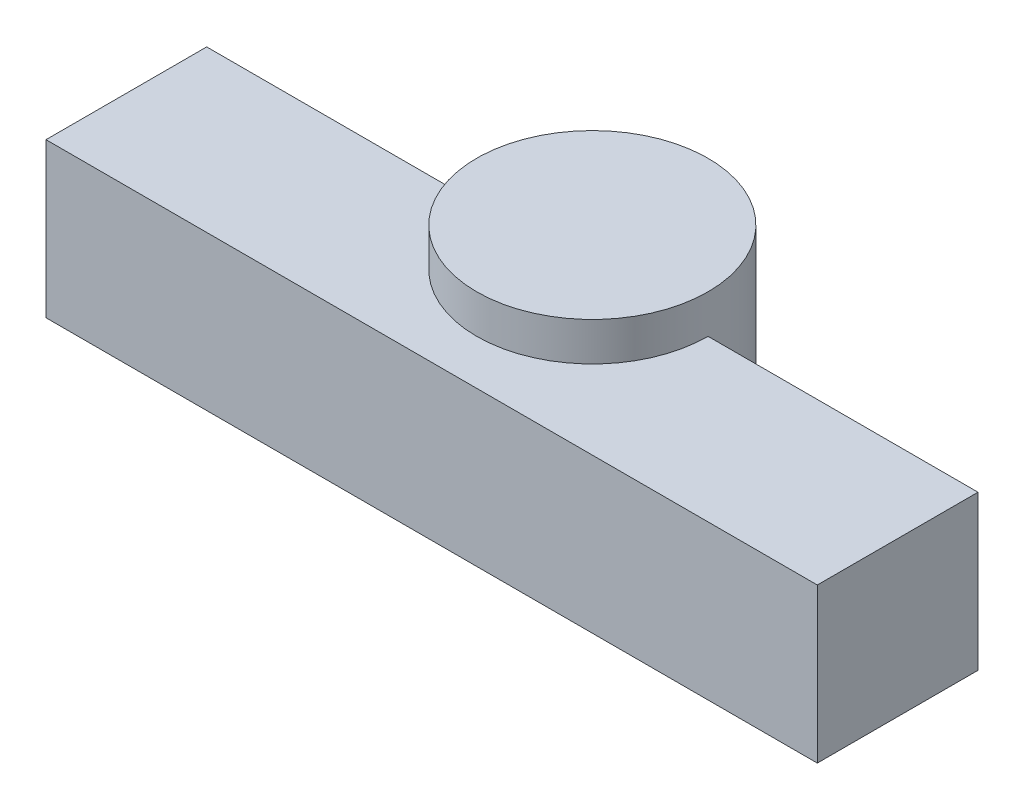
ISO-10303-21;
HEADER;
FILE_DESCRIPTION(('STEP AP214'),'2;1');
FILE_NAME('part.step','',(''),(''),'','','');
FILE_SCHEMA(('AUTOMOTIVE_DESIGN { 1 0 10303 214 1 1 1 1 }'));
ENDSEC;
DATA;
#1=APPLICATION_CONTEXT('core data for automotive mechanical design processes');
#2=APPLICATION_PROTOCOL_DEFINITION('international standard','automotive_design',2000,#1);
#3=PRODUCT_CONTEXT('',#1,'mechanical');
#4=PRODUCT('Part','Part','',(#3));
#5=PRODUCT_RELATED_PRODUCT_CATEGORY('part','',(#4));
#6=PRODUCT_DEFINITION_FORMATION('','',#4);
#7=PRODUCT_DEFINITION_CONTEXT('part definition',#1,'design');
#8=PRODUCT_DEFINITION('design','',#6,#7);
#9=PRODUCT_DEFINITION_SHAPE('','',#8);
#10=(LENGTH_UNIT() NAMED_UNIT(*) SI_UNIT(.MILLI.,.METRE.));
#11=(NAMED_UNIT(*) PLANE_ANGLE_UNIT() SI_UNIT($,.RADIAN.));
#12=(NAMED_UNIT(*) SI_UNIT($,.STERADIAN.) SOLID_ANGLE_UNIT());
#13=UNCERTAINTY_MEASURE_WITH_UNIT(LENGTH_MEASURE(1.E-05),#10,'distance_accuracy_value','');
#14=(GEOMETRIC_REPRESENTATION_CONTEXT(3) GLOBAL_UNCERTAINTY_ASSIGNED_CONTEXT((#13)) GLOBAL_UNIT_ASSIGNED_CONTEXT((#10,
#11,#12)) REPRESENTATION_CONTEXT('',''));
#15=CARTESIAN_POINT('',(0.,0.,0.));
#16=DIRECTION('',(0.,0.,1.));
#17=DIRECTION('',(1.,0.,0.));
#18=AXIS2_PLACEMENT_3D('',#15,#16,#17);
#19=CARTESIAN_POINT('',(0.,0.,0.));
#20=DIRECTION('',(0.,0.,-1.));
#21=DIRECTION('',(-1.,0.,0.));
#22=AXIS2_PLACEMENT_3D('',#19,#20,#21);
#23=PLANE('',#22);
#24=DIRECTION('',(1.,0.,0.));
#25=VECTOR('',#24,1.);
#26=CARTESIAN_POINT('',(-60000.,0.,0.));
#27=LINE('',#26,#25);
#28=CARTESIAN_POINT('',(18000.,0.,0.));
#29=VERTEX_POINT('',#28);
#30=CARTESIAN_POINT('',(60000.,0.,0.));
#31=VERTEX_POINT('',#30);
#32=EDGE_CURVE('E113',#29,#31,#27,.T.);
#33=ORIENTED_EDGE('',*,*,#32,.F.);
#34=DIRECTION('',(0.,-1.,0.));
#35=VECTOR('',#34,1.);
#36=CARTESIAN_POINT('',(18000.,30000.,0.));
#37=LINE('',#36,#35);
#38=CARTESIAN_POINT('',(18000.,24000.,0.));
#39=VERTEX_POINT('',#38);
#40=EDGE_CURVE('E11',#29,#39,#37,.F.);
#41=ORIENTED_EDGE('',*,*,#40,.T.);
#42=DIRECTION('',(-1.,0.,0.));
#43=VECTOR('',#42,1.);
#44=CARTESIAN_POINT('',(-60000.,24000.,0.));
#45=LINE('',#44,#43);
#46=CARTESIAN_POINT('',(60000.,24000.,0.));
#47=VERTEX_POINT('',#46);
#48=EDGE_CURVE('E135',#47,#39,#45,.T.);
#49=ORIENTED_EDGE('',*,*,#48,.F.);
#50=DIRECTION('',(0.,1.,0.));
#51=VECTOR('',#50,1.);
#52=CARTESIAN_POINT('',(60000.,0.,0.));
#53=LINE('',#52,#51);
#54=EDGE_CURVE('E125',#31,#47,#53,.T.);
#55=ORIENTED_EDGE('',*,*,#54,.F.);
#56=EDGE_LOOP('',(#33,#41,#49,#55));
#57=FACE_BOUND('',#56,.T.);
#58=ADVANCED_FACE('F44',(#57),#23,.T.);
#59=CARTESIAN_POINT('',(-18000.,24000.,0.));
#60=VERTEX_POINT('',#59);
#61=CARTESIAN_POINT('',(-60000.,24000.,0.));
#62=VERTEX_POINT('',#61);
#63=EDGE_CURVE('E93',#60,#62,#45,.T.);
#64=ORIENTED_EDGE('',*,*,#63,.F.);
#65=DIRECTION('',(0.,-1.,0.));
#66=VECTOR('',#65,1.);
#67=CARTESIAN_POINT('',(-18000.,30000.,0.));
#68=LINE('',#67,#66);
#69=CARTESIAN_POINT('',(-18000.,0.,0.));
#70=VERTEX_POINT('',#69);
#71=EDGE_CURVE('E53',#60,#70,#68,.T.);
#72=ORIENTED_EDGE('',*,*,#71,.T.);
#73=CARTESIAN_POINT('',(-60000.,0.,0.));
#74=VERTEX_POINT('',#73);
#75=EDGE_CURVE('E119',#74,#70,#27,.T.);
#76=ORIENTED_EDGE('',*,*,#75,.F.);
#77=DIRECTION('',(0.,-1.,0.));
#78=VECTOR('',#77,1.);
#79=CARTESIAN_POINT('',(-60000.,0.,0.));
#80=LINE('',#79,#78);
#81=EDGE_CURVE('E122',#62,#74,#80,.T.);
#82=ORIENTED_EDGE('',*,*,#81,.F.);
#83=EDGE_LOOP('',(#64,#72,#76,#82));
#84=FACE_BOUND('',#83,.T.);
#85=ADVANCED_FACE('F155',(#84),#23,.T.);
#86=CARTESIAN_POINT('',(-60000.,0.,25000.));
#87=DIRECTION('',(1.,0.,0.));
#88=DIRECTION('',(0.,0.,-1.));
#89=AXIS2_PLACEMENT_3D('',#86,#87,#88);
#90=PLANE('',#89);
#91=ORIENTED_EDGE('',*,*,#81,.T.);
#92=DIRECTION('',(0.,0.,-1.));
#93=VECTOR('',#92,1.);
#94=CARTESIAN_POINT('',(-60000.,0.,25000.));
#95=LINE('',#94,#93);
#96=CARTESIAN_POINT('',(-60000.,0.,25000.));
#97=VERTEX_POINT('',#96);
#98=EDGE_CURVE('E146',#97,#74,#95,.T.);
#99=ORIENTED_EDGE('',*,*,#98,.F.);
#100=DIRECTION('',(0.,-1.,0.));
#101=VECTOR('',#100,1.);
#102=CARTESIAN_POINT('',(-60000.,0.,25000.));
#103=LINE('',#102,#101);
#104=CARTESIAN_POINT('',(-60000.,24000.,25000.));
#105=VERTEX_POINT('',#104);
#106=EDGE_CURVE('E140',#105,#97,#103,.T.);
#107=ORIENTED_EDGE('',*,*,#106,.F.);
#108=DIRECTION('',(0.,0.,-1.));
#109=VECTOR('',#108,1.);
#110=CARTESIAN_POINT('',(-60000.,24000.,25000.));
#111=LINE('',#110,#109);
#112=EDGE_CURVE('E138',#105,#62,#111,.T.);
#113=ORIENTED_EDGE('',*,*,#112,.T.);
#114=EDGE_LOOP('',(#91,#99,#107,#113));
#115=FACE_BOUND('',#114,.T.);
#116=ADVANCED_FACE('F50',(#115),#90,.F.);
#117=CARTESIAN_POINT('',(-60000.,0.,25000.));
#118=DIRECTION('',(0.,1.,0.));
#119=DIRECTION('',(0.,0.,1.));
#120=AXIS2_PLACEMENT_3D('',#117,#118,#119);
#121=PLANE('',#120);
#122=ORIENTED_EDGE('',*,*,#75,.T.);
#123=CARTESIAN_POINT('',(0.,0.,0.));
#124=DIRECTION('',(0.,1.,0.));
#125=DIRECTION('',(0.,0.,1.));
#126=AXIS2_PLACEMENT_3D('',#123,#124,#125);
#127=CIRCLE('',#126,18000.);
#128=EDGE_CURVE('E63',#29,#70,#127,.T.);
#129=ORIENTED_EDGE('',*,*,#128,.F.);
#130=ORIENTED_EDGE('',*,*,#32,.T.);
#131=DIRECTION('',(0.,0.,-1.));
#132=VECTOR('',#131,1.);
#133=CARTESIAN_POINT('',(60000.,0.,25000.));
#134=LINE('',#133,#132);
#135=CARTESIAN_POINT('',(60000.,0.,25000.));
#136=VERTEX_POINT('',#135);
#137=EDGE_CURVE('E144',#136,#31,#134,.T.);
#138=ORIENTED_EDGE('',*,*,#137,.F.);
#139=DIRECTION('',(1.,0.,0.));
#140=VECTOR('',#139,1.);
#141=CARTESIAN_POINT('',(-60000.,0.,25000.));
#142=LINE('',#141,#140);
#143=EDGE_CURVE('E97',#97,#136,#142,.T.);
#144=ORIENTED_EDGE('',*,*,#143,.F.);
#145=ORIENTED_EDGE('',*,*,#98,.T.);
#146=EDGE_LOOP('',(#122,#129,#130,#138,#144,#145));
#147=FACE_BOUND('',#146,.T.);
#148=ADVANCED_FACE('F111',(#147),#121,.F.);
#149=CARTESIAN_POINT('',(60000.,0.,25000.));
#150=DIRECTION('',(-1.,0.,0.));
#151=DIRECTION('',(0.,0.,1.));
#152=AXIS2_PLACEMENT_3D('',#149,#150,#151);
#153=PLANE('',#152);
#154=ORIENTED_EDGE('',*,*,#54,.T.);
#155=DIRECTION('',(0.,0.,-1.));
#156=VECTOR('',#155,1.);
#157=CARTESIAN_POINT('',(60000.,24000.,25000.));
#158=LINE('',#157,#156);
#159=CARTESIAN_POINT('',(60000.,24000.,25000.));
#160=VERTEX_POINT('',#159);
#161=EDGE_CURVE('E143',#160,#47,#158,.T.);
#162=ORIENTED_EDGE('',*,*,#161,.F.);
#163=DIRECTION('',(0.,1.,0.));
#164=VECTOR('',#163,1.);
#165=CARTESIAN_POINT('',(60000.,0.,25000.));
#166=LINE('',#165,#164);
#167=EDGE_CURVE('E164',#136,#160,#166,.T.);
#168=ORIENTED_EDGE('',*,*,#167,.F.);
#169=ORIENTED_EDGE('',*,*,#137,.T.);
#170=EDGE_LOOP('',(#154,#162,#168,#169));
#171=FACE_BOUND('',#170,.T.);
#172=ADVANCED_FACE('F172',(#171),#153,.F.);
#173=CARTESIAN_POINT('',(-60000.,24000.,25000.));
#174=DIRECTION('',(0.,-1.,0.));
#175=DIRECTION('',(0.,0.,-1.));
#176=AXIS2_PLACEMENT_3D('',#173,#174,#175);
#177=PLANE('',#176);
#178=CARTESIAN_POINT('',(0.,24000.,0.));
#179=DIRECTION('',(0.,-1.,0.));
#180=DIRECTION('',(0.,0.,-1.));
#181=AXIS2_PLACEMENT_3D('',#178,#179,#180);
#182=CIRCLE('',#181,18000.);
#183=EDGE_CURVE('E107',#60,#39,#182,.F.);
#184=ORIENTED_EDGE('',*,*,#183,.F.);
#185=ORIENTED_EDGE('',*,*,#63,.T.);
#186=ORIENTED_EDGE('',*,*,#112,.F.);
#187=DIRECTION('',(-1.,0.,0.));
#188=VECTOR('',#187,1.);
#189=CARTESIAN_POINT('',(-60000.,24000.,25000.));
#190=LINE('',#189,#188);
#191=EDGE_CURVE('E69',#160,#105,#190,.T.);
#192=ORIENTED_EDGE('',*,*,#191,.F.);
#193=ORIENTED_EDGE('',*,*,#161,.T.);
#194=ORIENTED_EDGE('',*,*,#48,.T.);
#195=EDGE_LOOP('',(#184,#185,#186,#192,#193,#194));
#196=FACE_BOUND('',#195,.T.);
#197=ADVANCED_FACE('F152',(#196),#177,.F.);
#198=CARTESIAN_POINT('',(0.,0.,25000.));
#199=DIRECTION('',(0.,0.,-1.));
#200=DIRECTION('',(-1.,0.,0.));
#201=AXIS2_PLACEMENT_3D('',#198,#199,#200);
#202=PLANE('',#201);
#203=ORIENTED_EDGE('',*,*,#106,.T.);
#204=ORIENTED_EDGE('',*,*,#143,.T.);
#205=ORIENTED_EDGE('',*,*,#167,.T.);
#206=ORIENTED_EDGE('',*,*,#191,.T.);
#207=EDGE_LOOP('',(#203,#204,#205,#206));
#208=FACE_BOUND('',#207,.T.);
#209=ADVANCED_FACE('F173',(#208),#202,.F.);
#210=CARTESIAN_POINT('',(0.,30000.,0.));
#211=DIRECTION('',(0.,-1.,0.));
#212=DIRECTION('',(0.,0.,-1.));
#213=AXIS2_PLACEMENT_3D('',#210,#211,#212);
#214=CYLINDRICAL_SURFACE('',#213,18000.);
#215=ORIENTED_EDGE('',*,*,#40,.F.);
#216=ORIENTED_EDGE('',*,*,#128,.T.);
#217=ORIENTED_EDGE('',*,*,#71,.F.);
#218=ORIENTED_EDGE('',*,*,#183,.T.);
#219=EDGE_LOOP('',(#215,#216,#217,#218));
#220=FACE_BOUND('',#219,.T.);
#221=CARTESIAN_POINT('',(0.,30000.,0.));
#222=DIRECTION('',(0.,1.,0.));
#223=DIRECTION('',(0.,0.,1.));
#224=AXIS2_PLACEMENT_3D('',#221,#222,#223);
#225=CIRCLE('',#224,18000.);
#226=CARTESIAN_POINT('',(0.,30000.,18000.));
#227=VERTEX_POINT('',#226);
#228=EDGE_CURVE('E120',#227,#227,#225,.T.);
#229=ORIENTED_EDGE('',*,*,#228,.F.);
#230=EDGE_LOOP('',(#229));
#231=FACE_BOUND('',#230,.T.);
#232=ADVANCED_FACE('F106',(#220,#231),#214,.T.);
#233=CARTESIAN_POINT('',(0.,30000.,0.));
#234=DIRECTION('',(0.,1.,0.));
#235=DIRECTION('',(0.,0.,1.));
#236=AXIS2_PLACEMENT_3D('',#233,#234,#235);
#237=PLANE('',#236);
#238=ORIENTED_EDGE('',*,*,#228,.T.);
#239=EDGE_LOOP('',(#238));
#240=FACE_BOUND('',#239,.T.);
#241=ADVANCED_FACE('F231',(#240),#237,.T.);
#242=CLOSED_SHELL('',(#58,#85,#116,#148,#172,#197,#209,#232,#241));
#243=MANIFOLD_SOLID_BREP('B2',#242);
#244=ADVANCED_BREP_SHAPE_REPRESENTATION('',(#18,#243),#14);
#245=SHAPE_DEFINITION_REPRESENTATION(#9,#244);
ENDSEC;
END-ISO-10303-21;
